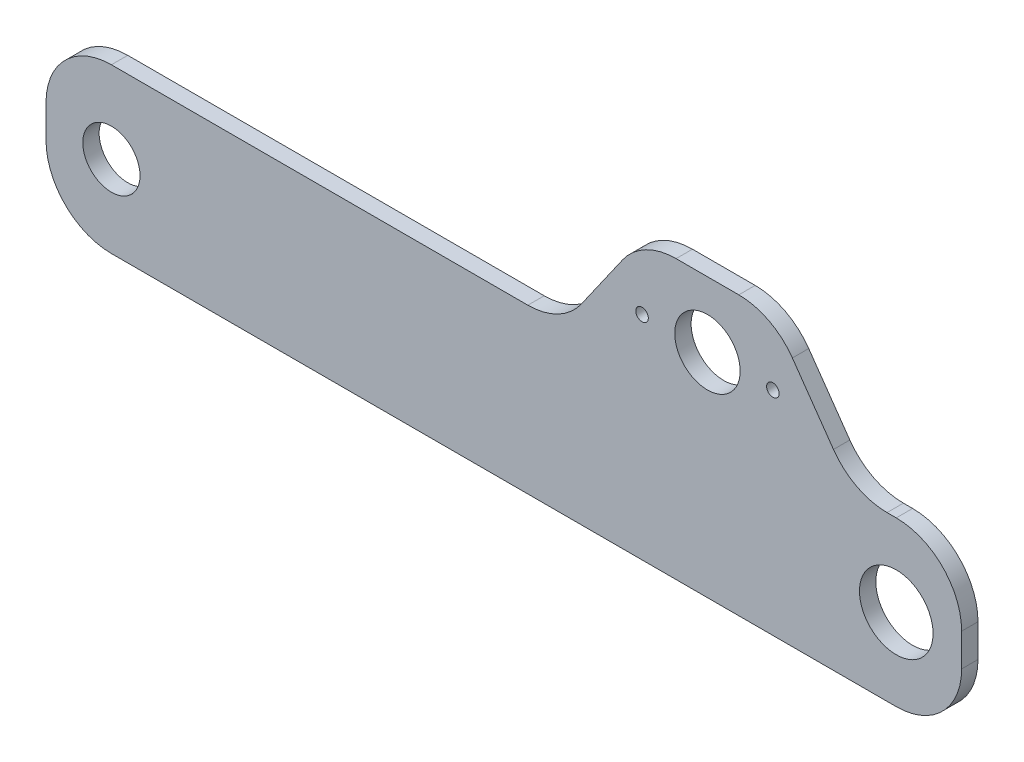
ISO-10303-21;
HEADER;
FILE_DESCRIPTION(('STEP AP214'),'2;1');
FILE_NAME('part.step','',(''),(''),'','','');
FILE_SCHEMA(('AUTOMOTIVE_DESIGN { 1 0 10303 214 1 1 1 1 }'));
ENDSEC;
DATA;
#1=APPLICATION_CONTEXT('core data for automotive mechanical design processes');
#2=APPLICATION_PROTOCOL_DEFINITION('international standard','automotive_design',2000,#1);
#3=PRODUCT_CONTEXT('',#1,'mechanical');
#4=PRODUCT('Part','Part','',(#3));
#5=PRODUCT_RELATED_PRODUCT_CATEGORY('part','',(#4));
#6=PRODUCT_DEFINITION_FORMATION('','',#4);
#7=PRODUCT_DEFINITION_CONTEXT('part definition',#1,'design');
#8=PRODUCT_DEFINITION('design','',#6,#7);
#9=PRODUCT_DEFINITION_SHAPE('','',#8);
#10=(LENGTH_UNIT() NAMED_UNIT(*) SI_UNIT(.MILLI.,.METRE.));
#11=(NAMED_UNIT(*) PLANE_ANGLE_UNIT() SI_UNIT($,.RADIAN.));
#12=(NAMED_UNIT(*) SI_UNIT($,.STERADIAN.) SOLID_ANGLE_UNIT());
#13=UNCERTAINTY_MEASURE_WITH_UNIT(LENGTH_MEASURE(1.E-05),#10,'distance_accuracy_value','');
#14=(GEOMETRIC_REPRESENTATION_CONTEXT(3) GLOBAL_UNCERTAINTY_ASSIGNED_CONTEXT((#13)) GLOBAL_UNIT_ASSIGNED_CONTEXT((#10,
#11,#12)) REPRESENTATION_CONTEXT('',''));
#15=CARTESIAN_POINT('',(0.,0.,0.));
#16=DIRECTION('',(0.,0.,1.));
#17=DIRECTION('',(1.,0.,0.));
#18=AXIS2_PLACEMENT_3D('',#15,#16,#17);
#19=CARTESIAN_POINT('',(341.76482123998,69.8499999999999,6.35));
#20=DIRECTION('',(0.,0.,1.));
#21=DIRECTION('',(1.,0.,0.));
#22=AXIS2_PLACEMENT_3D('',#19,#20,#21);
#23=PLANE('',#22);
#24=CARTESIAN_POINT('',(341.76482123998,76.2,6.35));
#25=DIRECTION('',(0.,0.,1.));
#26=DIRECTION('',(1.,0.,0.));
#27=AXIS2_PLACEMENT_3D('',#24,#25,#26);
#28=CIRCLE('',#27,14.2875);
#29=CARTESIAN_POINT('',(356.05232123998,76.2,6.35));
#30=VERTEX_POINT('',#29);
#31=EDGE_CURVE('E400',#30,#30,#28,.T.);
#32=ORIENTED_EDGE('',*,*,#31,.F.);
#33=EDGE_LOOP('',(#32));
#34=FACE_BOUND('',#33,.T.);
#35=CARTESIAN_POINT('',(36.9648212399797,76.2,6.35));
#36=DIRECTION('',(0.,0.,1.));
#37=DIRECTION('',(1.,0.,0.));
#38=AXIS2_PLACEMENT_3D('',#35,#36,#37);
#39=CIRCLE('',#38,11.1125);
#40=CARTESIAN_POINT('',(48.0773212399797,76.2,6.35));
#41=VERTEX_POINT('',#40);
#42=EDGE_CURVE('E416',#41,#41,#39,.T.);
#43=ORIENTED_EDGE('',*,*,#42,.F.);
#44=EDGE_LOOP('',(#43));
#45=FACE_BOUND('',#44,.T.);
#46=CARTESIAN_POINT('',(341.76482123998,69.8499999999999,6.35));
#47=DIRECTION('',(0.,0.,1.));
#48=DIRECTION('',(1.,0.,0.));
#49=AXIS2_PLACEMENT_3D('',#46,#47,#48);
#50=CIRCLE('',#49,25.4);
#51=CARTESIAN_POINT('',(341.764821239979,44.4499999999999,6.35));
#52=VERTEX_POINT('',#51);
#53=CARTESIAN_POINT('',(367.16482123998,69.8500000000001,6.35));
#54=VERTEX_POINT('',#53);
#55=EDGE_CURVE('E236',#52,#54,#50,.T.);
#56=ORIENTED_EDGE('',*,*,#55,.T.);
#57=DIRECTION('',(0.,1.,0.));
#58=VECTOR('',#57,1.);
#59=CARTESIAN_POINT('',(367.16482123998,69.8500000000001,6.35));
#60=LINE('',#59,#58);
#61=CARTESIAN_POINT('',(367.16482123998,82.5499999999998,6.35));
#62=VERTEX_POINT('',#61);
#63=EDGE_CURVE('E124',#54,#62,#60,.T.);
#64=ORIENTED_EDGE('',*,*,#63,.T.);
#65=CARTESIAN_POINT('',(341.76482123998,82.55,6.35));
#66=DIRECTION('',(0.,0.,1.));
#67=DIRECTION('',(-1.,0.,0.));
#68=AXIS2_PLACEMENT_3D('',#65,#66,#67);
#69=CIRCLE('',#68,25.4);
#70=CARTESIAN_POINT('',(341.764821239979,107.95,6.35));
#71=VERTEX_POINT('',#70);
#72=EDGE_CURVE('E289',#62,#71,#69,.T.);
#73=ORIENTED_EDGE('',*,*,#72,.T.);
#74=DIRECTION('',(-1.,0.,0.));
#75=VECTOR('',#74,1.);
#76=CARTESIAN_POINT('',(338.192123961331,107.95,6.35));
#77=LINE('',#76,#75);
#78=CARTESIAN_POINT('',(338.192123961331,107.95,6.35));
#79=VERTEX_POINT('',#78);
#80=EDGE_CURVE('E309',#71,#79,#77,.T.);
#81=ORIENTED_EDGE('',*,*,#80,.T.);
#82=CARTESIAN_POINT('',(338.192123961331,133.35,6.35));
#83=DIRECTION('',(0.,0.,-1.));
#84=DIRECTION('',(1.,0.,0.));
#85=AXIS2_PLACEMENT_3D('',#82,#83,#84);
#86=CIRCLE('',#85,25.4);
#87=CARTESIAN_POINT('',(317.38566203639,118.781158516684,6.35));
#88=VERTEX_POINT('',#87);
#89=EDGE_CURVE('E305',#79,#88,#86,.T.);
#90=ORIENTED_EDGE('',*,*,#89,.T.);
#91=DIRECTION('',(-0.573576436351044,0.819152044288993,0.));
#92=VECTOR('',#91,1.);
#93=CARTESIAN_POINT('',(301.429554644821,141.568841483316,6.35));
#94=LINE('',#93,#92);
#95=CARTESIAN_POINT('',(301.429554644821,141.568841483316,6.35));
#96=VERTEX_POINT('',#95);
#97=EDGE_CURVE('E308',#88,#96,#94,.T.);
#98=ORIENTED_EDGE('',*,*,#97,.T.);
#99=CARTESIAN_POINT('',(280.623092719881,127.,6.35));
#100=DIRECTION('',(0.,0.,1.));
#101=DIRECTION('',(-1.,0.,0.));
#102=AXIS2_PLACEMENT_3D('',#99,#100,#101);
#103=CIRCLE('',#102,25.4);
#104=CARTESIAN_POINT('',(280.623092719881,152.4,6.35));
#105=VERTEX_POINT('',#104);
#106=EDGE_CURVE('E313',#96,#105,#103,.T.);
#107=ORIENTED_EDGE('',*,*,#106,.T.);
#108=DIRECTION('',(-1.,0.,0.));
#109=VECTOR('',#108,1.);
#110=CARTESIAN_POINT('',(256.267898887909,152.4,6.35));
#111=LINE('',#110,#109);
#112=CARTESIAN_POINT('',(256.267898887909,152.4,6.35));
#113=VERTEX_POINT('',#112);
#114=EDGE_CURVE('E320',#105,#113,#111,.T.);
#115=ORIENTED_EDGE('',*,*,#114,.T.);
#116=CARTESIAN_POINT('',(256.267898887909,127.,6.35));
#117=DIRECTION('',(0.,0.,1.));
#118=DIRECTION('',(-1.,0.,0.));
#119=AXIS2_PLACEMENT_3D('',#116,#117,#118);
#120=CIRCLE('',#119,25.4);
#121=CARTESIAN_POINT('',(235.461436962969,141.568841483316,6.35));
#122=VERTEX_POINT('',#121);
#123=EDGE_CURVE('E323',#113,#122,#120,.T.);
#124=ORIENTED_EDGE('',*,*,#123,.T.);
#125=DIRECTION('',(-0.573576436351043,-0.819152044288994,0.));
#126=VECTOR('',#125,1.);
#127=CARTESIAN_POINT('',(219.5053295714,118.781158516684,6.35));
#128=LINE('',#127,#126);
#129=CARTESIAN_POINT('',(219.5053295714,118.781158516684,6.35));
#130=VERTEX_POINT('',#129);
#131=EDGE_CURVE('E326',#122,#130,#128,.T.);
#132=ORIENTED_EDGE('',*,*,#131,.T.);
#133=CARTESIAN_POINT('',(198.698867646459,133.35,6.35));
#134=DIRECTION('',(0.,0.,-1.));
#135=DIRECTION('',(-1.,0.,0.));
#136=AXIS2_PLACEMENT_3D('',#133,#134,#135);
#137=CIRCLE('',#136,25.4);
#138=CARTESIAN_POINT('',(198.698867646459,107.95,6.35));
#139=VERTEX_POINT('',#138);
#140=EDGE_CURVE('E329',#130,#139,#137,.T.);
#141=ORIENTED_EDGE('',*,*,#140,.T.);
#142=DIRECTION('',(-1.,0.,0.));
#143=VECTOR('',#142,1.);
#144=CARTESIAN_POINT('',(36.9648212399799,107.95,6.35));
#145=LINE('',#144,#143);
#146=CARTESIAN_POINT('',(36.9648212399799,107.95,6.35));
#147=VERTEX_POINT('',#146);
#148=EDGE_CURVE('E332',#139,#147,#145,.T.);
#149=ORIENTED_EDGE('',*,*,#148,.T.);
#150=CARTESIAN_POINT('',(36.9648212399797,82.55,6.35));
#151=DIRECTION('',(0.,0.,1.));
#152=DIRECTION('',(-1.,0.,0.));
#153=AXIS2_PLACEMENT_3D('',#150,#151,#152);
#154=CIRCLE('',#153,25.4);
#155=CARTESIAN_POINT('',(11.5648212399797,82.5499999999998,6.35));
#156=VERTEX_POINT('',#155);
#157=EDGE_CURVE('E167',#147,#156,#154,.T.);
#158=ORIENTED_EDGE('',*,*,#157,.T.);
#159=DIRECTION('',(0.,-1.,0.));
#160=VECTOR('',#159,1.);
#161=CARTESIAN_POINT('',(11.5648212399797,69.8500000000002,6.35));
#162=LINE('',#161,#160);
#163=CARTESIAN_POINT('',(11.5648212399797,69.85,6.35));
#164=VERTEX_POINT('',#163);
#165=EDGE_CURVE('E161',#156,#164,#162,.T.);
#166=ORIENTED_EDGE('',*,*,#165,.T.);
#167=CARTESIAN_POINT('',(36.9648212399797,69.85,6.35));
#168=DIRECTION('',(0.,0.,1.));
#169=DIRECTION('',(-1.,0.,0.));
#170=AXIS2_PLACEMENT_3D('',#167,#168,#169);
#171=CIRCLE('',#170,25.4);
#172=CARTESIAN_POINT('',(36.9648212399799,44.45,6.35));
#173=VERTEX_POINT('',#172);
#174=EDGE_CURVE('E165',#164,#173,#171,.T.);
#175=ORIENTED_EDGE('',*,*,#174,.T.);
#176=DIRECTION('',(1.,0.,0.));
#177=VECTOR('',#176,1.);
#178=CARTESIAN_POINT('',(36.9648212399799,44.45,6.35));
#179=LINE('',#178,#177);
#180=EDGE_CURVE('E57',#173,#52,#179,.T.);
#181=ORIENTED_EDGE('',*,*,#180,.T.);
#182=EDGE_LOOP('',(#56,#64,#73,#81,#90,#98,#107,#115,#124,#132,#141,#149,#158,#166,#175,#181));
#183=FACE_BOUND('',#182,.T.);
#184=CARTESIAN_POINT('',(243.045495803895,127.,6.35));
#185=DIRECTION('',(0.,0.,1.));
#186=DIRECTION('',(1.,0.,0.));
#187=AXIS2_PLACEMENT_3D('',#184,#185,#186);
#188=CIRCLE('',#187,2.43839999999994);
#189=CARTESIAN_POINT('',(245.483895803895,127.,6.35));
#190=VERTEX_POINT('',#189);
#191=EDGE_CURVE('E194',#190,#190,#188,.T.);
#192=ORIENTED_EDGE('',*,*,#191,.F.);
#193=EDGE_LOOP('',(#192));
#194=FACE_BOUND('',#193,.T.);
#195=CARTESIAN_POINT('',(293.845495803895,127.,6.35));
#196=DIRECTION('',(0.,0.,1.));
#197=DIRECTION('',(1.,0.,0.));
#198=AXIS2_PLACEMENT_3D('',#195,#196,#197);
#199=CIRCLE('',#198,2.4384);
#200=CARTESIAN_POINT('',(296.283895803895,127.,6.35));
#201=VERTEX_POINT('',#200);
#202=EDGE_CURVE('E408',#201,#201,#199,.T.);
#203=ORIENTED_EDGE('',*,*,#202,.F.);
#204=EDGE_LOOP('',(#203));
#205=FACE_BOUND('',#204,.T.);
#206=CARTESIAN_POINT('',(268.445495803895,127.,6.35));
#207=DIRECTION('',(0.,0.,1.));
#208=DIRECTION('',(1.,0.,0.));
#209=AXIS2_PLACEMENT_3D('',#206,#207,#208);
#210=CIRCLE('',#209,12.7);
#211=CARTESIAN_POINT('',(281.145495803895,127.,6.35));
#212=VERTEX_POINT('',#211);
#213=EDGE_CURVE('E389',#212,#212,#210,.T.);
#214=ORIENTED_EDGE('',*,*,#213,.F.);
#215=EDGE_LOOP('',(#214));
#216=FACE_BOUND('',#215,.T.);
#217=ADVANCED_FACE('F39',(#34,#45,#183,#194,#205,#216),#23,.T.);
#218=CARTESIAN_POINT('',(341.76482123998,69.8499999999999,0.));
#219=DIRECTION('',(0.,0.,1.));
#220=DIRECTION('',(1.,0.,0.));
#221=AXIS2_PLACEMENT_3D('',#218,#219,#220);
#222=PLANE('',#221);
#223=CARTESIAN_POINT('',(341.76482123998,69.8499999999999,0.));
#224=DIRECTION('',(0.,0.,1.));
#225=DIRECTION('',(1.,0.,0.));
#226=AXIS2_PLACEMENT_3D('',#223,#224,#225);
#227=CIRCLE('',#226,25.4);
#228=CARTESIAN_POINT('',(341.764821239979,44.4499999999999,0.));
#229=VERTEX_POINT('',#228);
#230=CARTESIAN_POINT('',(367.16482123998,69.8500000000001,0.));
#231=VERTEX_POINT('',#230);
#232=EDGE_CURVE('E189',#229,#231,#227,.T.);
#233=ORIENTED_EDGE('',*,*,#232,.F.);
#234=DIRECTION('',(1.,0.,0.));
#235=VECTOR('',#234,1.);
#236=CARTESIAN_POINT('',(36.9648212399799,44.45,0.));
#237=LINE('',#236,#235);
#238=CARTESIAN_POINT('',(36.9648212399799,44.45,0.));
#239=VERTEX_POINT('',#238);
#240=EDGE_CURVE('E116',#239,#229,#237,.T.);
#241=ORIENTED_EDGE('',*,*,#240,.F.);
#242=CARTESIAN_POINT('',(36.9648212399797,69.85,0.));
#243=DIRECTION('',(0.,0.,1.));
#244=DIRECTION('',(-1.,0.,0.));
#245=AXIS2_PLACEMENT_3D('',#242,#243,#244);
#246=CIRCLE('',#245,25.4);
#247=CARTESIAN_POINT('',(11.5648212399797,69.85,0.));
#248=VERTEX_POINT('',#247);
#249=EDGE_CURVE('E110',#248,#239,#246,.T.);
#250=ORIENTED_EDGE('',*,*,#249,.F.);
#251=DIRECTION('',(0.,-1.,0.));
#252=VECTOR('',#251,1.);
#253=CARTESIAN_POINT('',(11.5648212399797,69.8500000000002,0.));
#254=LINE('',#253,#252);
#255=CARTESIAN_POINT('',(11.5648212399797,82.5499999999998,0.));
#256=VERTEX_POINT('',#255);
#257=EDGE_CURVE('E176',#256,#248,#254,.T.);
#258=ORIENTED_EDGE('',*,*,#257,.F.);
#259=CARTESIAN_POINT('',(36.9648212399797,82.55,0.));
#260=DIRECTION('',(0.,0.,1.));
#261=DIRECTION('',(-1.,0.,0.));
#262=AXIS2_PLACEMENT_3D('',#259,#260,#261);
#263=CIRCLE('',#262,25.4);
#264=CARTESIAN_POINT('',(36.9648212399799,107.95,0.));
#265=VERTEX_POINT('',#264);
#266=EDGE_CURVE('E227',#265,#256,#263,.T.);
#267=ORIENTED_EDGE('',*,*,#266,.F.);
#268=DIRECTION('',(-1.,0.,0.));
#269=VECTOR('',#268,1.);
#270=CARTESIAN_POINT('',(36.9648212399799,107.95,0.));
#271=LINE('',#270,#269);
#272=CARTESIAN_POINT('',(198.698867646459,107.95,0.));
#273=VERTEX_POINT('',#272);
#274=EDGE_CURVE('E224',#273,#265,#271,.T.);
#275=ORIENTED_EDGE('',*,*,#274,.F.);
#276=CARTESIAN_POINT('',(198.698867646459,133.35,0.));
#277=DIRECTION('',(0.,0.,-1.));
#278=DIRECTION('',(-1.,0.,0.));
#279=AXIS2_PLACEMENT_3D('',#276,#277,#278);
#280=CIRCLE('',#279,25.4);
#281=CARTESIAN_POINT('',(219.5053295714,118.781158516684,0.));
#282=VERTEX_POINT('',#281);
#283=EDGE_CURVE('E221',#282,#273,#280,.T.);
#284=ORIENTED_EDGE('',*,*,#283,.F.);
#285=DIRECTION('',(-0.573576436351043,-0.819152044288994,0.));
#286=VECTOR('',#285,1.);
#287=CARTESIAN_POINT('',(219.5053295714,118.781158516684,0.));
#288=LINE('',#287,#286);
#289=CARTESIAN_POINT('',(235.461436962969,141.568841483316,0.));
#290=VERTEX_POINT('',#289);
#291=EDGE_CURVE('E218',#290,#282,#288,.T.);
#292=ORIENTED_EDGE('',*,*,#291,.F.);
#293=CARTESIAN_POINT('',(256.267898887909,127.,0.));
#294=DIRECTION('',(0.,0.,1.));
#295=DIRECTION('',(-1.,0.,0.));
#296=AXIS2_PLACEMENT_3D('',#293,#294,#295);
#297=CIRCLE('',#296,25.4);
#298=CARTESIAN_POINT('',(256.267898887909,152.4,0.));
#299=VERTEX_POINT('',#298);
#300=EDGE_CURVE('E215',#299,#290,#297,.T.);
#301=ORIENTED_EDGE('',*,*,#300,.F.);
#302=DIRECTION('',(-1.,0.,0.));
#303=VECTOR('',#302,1.);
#304=CARTESIAN_POINT('',(256.267898887909,152.4,0.));
#305=LINE('',#304,#303);
#306=CARTESIAN_POINT('',(280.623092719881,152.4,0.));
#307=VERTEX_POINT('',#306);
#308=EDGE_CURVE('E212',#307,#299,#305,.T.);
#309=ORIENTED_EDGE('',*,*,#308,.F.);
#310=CARTESIAN_POINT('',(280.623092719881,127.,0.));
#311=DIRECTION('',(0.,0.,1.));
#312=DIRECTION('',(-1.,0.,0.));
#313=AXIS2_PLACEMENT_3D('',#310,#311,#312);
#314=CIRCLE('',#313,25.4);
#315=CARTESIAN_POINT('',(301.429554644821,141.568841483316,0.));
#316=VERTEX_POINT('',#315);
#317=EDGE_CURVE('E209',#316,#307,#314,.T.);
#318=ORIENTED_EDGE('',*,*,#317,.F.);
#319=DIRECTION('',(-0.573576436351044,0.819152044288993,0.));
#320=VECTOR('',#319,1.);
#321=CARTESIAN_POINT('',(301.429554644821,141.568841483316,0.));
#322=LINE('',#321,#320);
#323=CARTESIAN_POINT('',(317.38566203639,118.781158516684,0.));
#324=VERTEX_POINT('',#323);
#325=EDGE_CURVE('E206',#324,#316,#322,.T.);
#326=ORIENTED_EDGE('',*,*,#325,.F.);
#327=CARTESIAN_POINT('',(338.192123961331,133.35,0.));
#328=DIRECTION('',(0.,0.,-1.));
#329=DIRECTION('',(1.,0.,0.));
#330=AXIS2_PLACEMENT_3D('',#327,#328,#329);
#331=CIRCLE('',#330,25.4);
#332=CARTESIAN_POINT('',(338.192123961331,107.95,0.));
#333=VERTEX_POINT('',#332);
#334=EDGE_CURVE('E203',#333,#324,#331,.T.);
#335=ORIENTED_EDGE('',*,*,#334,.F.);
#336=DIRECTION('',(-1.,0.,0.));
#337=VECTOR('',#336,1.);
#338=CARTESIAN_POINT('',(338.192123961331,107.95,0.));
#339=LINE('',#338,#337);
#340=CARTESIAN_POINT('',(341.764821239979,107.95,0.));
#341=VERTEX_POINT('',#340);
#342=EDGE_CURVE('E200',#341,#333,#339,.T.);
#343=ORIENTED_EDGE('',*,*,#342,.F.);
#344=CARTESIAN_POINT('',(341.76482123998,82.55,0.));
#345=DIRECTION('',(0.,0.,1.));
#346=DIRECTION('',(-1.,0.,0.));
#347=AXIS2_PLACEMENT_3D('',#344,#345,#346);
#348=CIRCLE('',#347,25.4);
#349=CARTESIAN_POINT('',(367.16482123998,82.5499999999998,0.));
#350=VERTEX_POINT('',#349);
#351=EDGE_CURVE('E197',#350,#341,#348,.T.);
#352=ORIENTED_EDGE('',*,*,#351,.F.);
#353=DIRECTION('',(0.,1.,0.));
#354=VECTOR('',#353,1.);
#355=CARTESIAN_POINT('',(367.16482123998,69.8500000000001,0.));
#356=LINE('',#355,#354);
#357=EDGE_CURVE('E193',#231,#350,#356,.T.);
#358=ORIENTED_EDGE('',*,*,#357,.F.);
#359=EDGE_LOOP('',(#233,#241,#250,#258,#267,#275,#284,#292,#301,#309,#318,#326,#335,#343,#352,#358));
#360=FACE_BOUND('',#359,.T.);
#361=CARTESIAN_POINT('',(243.045495803895,127.,0.));
#362=DIRECTION('',(0.,0.,1.));
#363=DIRECTION('',(1.,0.,0.));
#364=AXIS2_PLACEMENT_3D('',#361,#362,#363);
#365=CIRCLE('',#364,2.43839999999994);
#366=CARTESIAN_POINT('',(245.483895803895,127.,0.));
#367=VERTEX_POINT('',#366);
#368=EDGE_CURVE('E420',#367,#367,#365,.T.);
#369=ORIENTED_EDGE('',*,*,#368,.T.);
#370=EDGE_LOOP('',(#369));
#371=FACE_BOUND('',#370,.T.);
#372=CARTESIAN_POINT('',(36.9648212399797,76.2,0.));
#373=DIRECTION('',(0.,0.,1.));
#374=DIRECTION('',(1.,0.,0.));
#375=AXIS2_PLACEMENT_3D('',#372,#373,#374);
#376=CIRCLE('',#375,11.1125);
#377=CARTESIAN_POINT('',(48.0773212399797,76.2,0.));
#378=VERTEX_POINT('',#377);
#379=EDGE_CURVE('E412',#378,#378,#376,.T.);
#380=ORIENTED_EDGE('',*,*,#379,.T.);
#381=EDGE_LOOP('',(#380));
#382=FACE_BOUND('',#381,.T.);
#383=CARTESIAN_POINT('',(293.845495803895,127.,0.));
#384=DIRECTION('',(0.,0.,1.));
#385=DIRECTION('',(1.,0.,0.));
#386=AXIS2_PLACEMENT_3D('',#383,#384,#385);
#387=CIRCLE('',#386,2.4384);
#388=CARTESIAN_POINT('',(296.283895803895,127.,0.));
#389=VERTEX_POINT('',#388);
#390=EDGE_CURVE('E404',#389,#389,#387,.T.);
#391=ORIENTED_EDGE('',*,*,#390,.T.);
#392=EDGE_LOOP('',(#391));
#393=FACE_BOUND('',#392,.T.);
#394=CARTESIAN_POINT('',(341.76482123998,76.2,0.));
#395=DIRECTION('',(0.,0.,1.));
#396=DIRECTION('',(1.,0.,0.));
#397=AXIS2_PLACEMENT_3D('',#394,#395,#396);
#398=CIRCLE('',#397,14.2875);
#399=CARTESIAN_POINT('',(356.05232123998,76.2,0.));
#400=VERTEX_POINT('',#399);
#401=EDGE_CURVE('E397',#400,#400,#398,.T.);
#402=ORIENTED_EDGE('',*,*,#401,.T.);
#403=EDGE_LOOP('',(#402));
#404=FACE_BOUND('',#403,.T.);
#405=CARTESIAN_POINT('',(268.445495803895,127.,0.));
#406=DIRECTION('',(0.,0.,1.));
#407=DIRECTION('',(1.,0.,0.));
#408=AXIS2_PLACEMENT_3D('',#405,#406,#407);
#409=CIRCLE('',#408,12.7);
#410=CARTESIAN_POINT('',(281.145495803895,127.,0.));
#411=VERTEX_POINT('',#410);
#412=EDGE_CURVE('E392',#411,#411,#409,.T.);
#413=ORIENTED_EDGE('',*,*,#412,.T.);
#414=EDGE_LOOP('',(#413));
#415=FACE_BOUND('',#414,.T.);
#416=ADVANCED_FACE('F293',(#360,#371,#382,#393,#404,#415),#222,.F.);
#417=CARTESIAN_POINT('',(341.76482123998,69.8499999999999,6.35));
#418=DIRECTION('',(0.,0.,-1.));
#419=DIRECTION('',(-1.,0.,0.));
#420=AXIS2_PLACEMENT_3D('',#417,#418,#419);
#421=CYLINDRICAL_SURFACE('',#420,25.4);
#422=ORIENTED_EDGE('',*,*,#232,.T.);
#423=DIRECTION('',(0.,0.,-1.));
#424=VECTOR('',#423,1.);
#425=CARTESIAN_POINT('',(367.16482123998,69.8500000000001,6.35));
#426=LINE('',#425,#424);
#427=EDGE_CURVE('E11',#54,#231,#426,.T.);
#428=ORIENTED_EDGE('',*,*,#427,.F.);
#429=ORIENTED_EDGE('',*,*,#55,.F.);
#430=DIRECTION('',(0.,0.,-1.));
#431=VECTOR('',#430,1.);
#432=CARTESIAN_POINT('',(341.764821239979,44.4499999999999,6.35));
#433=LINE('',#432,#431);
#434=EDGE_CURVE('E185',#52,#229,#433,.T.);
#435=ORIENTED_EDGE('',*,*,#434,.T.);
#436=EDGE_LOOP('',(#422,#428,#429,#435));
#437=FACE_BOUND('',#436,.T.);
#438=ADVANCED_FACE('F41',(#437),#421,.T.);
#439=CARTESIAN_POINT('',(367.16482123998,69.8500000000001,6.35));
#440=DIRECTION('',(-1.,0.,0.));
#441=DIRECTION('',(0.,0.,1.));
#442=AXIS2_PLACEMENT_3D('',#439,#440,#441);
#443=PLANE('',#442);
#444=ORIENTED_EDGE('',*,*,#357,.T.);
#445=DIRECTION('',(0.,0.,-1.));
#446=VECTOR('',#445,1.);
#447=CARTESIAN_POINT('',(367.16482123998,82.5499999999998,6.35));
#448=LINE('',#447,#446);
#449=EDGE_CURVE('E49',#62,#350,#448,.T.);
#450=ORIENTED_EDGE('',*,*,#449,.F.);
#451=ORIENTED_EDGE('',*,*,#63,.F.);
#452=ORIENTED_EDGE('',*,*,#427,.T.);
#453=EDGE_LOOP('',(#444,#450,#451,#452));
#454=FACE_BOUND('',#453,.T.);
#455=ADVANCED_FACE('F585',(#454),#443,.F.);
#456=CARTESIAN_POINT('',(341.76482123998,82.55,6.35));
#457=DIRECTION('',(0.,0.,-1.));
#458=DIRECTION('',(-1.,0.,0.));
#459=AXIS2_PLACEMENT_3D('',#456,#457,#458);
#460=CYLINDRICAL_SURFACE('',#459,25.4);
#461=ORIENTED_EDGE('',*,*,#351,.T.);
#462=DIRECTION('',(0.,0.,-1.));
#463=VECTOR('',#462,1.);
#464=CARTESIAN_POINT('',(341.764821239979,107.95,6.35));
#465=LINE('',#464,#463);
#466=EDGE_CURVE('E279',#71,#341,#465,.T.);
#467=ORIENTED_EDGE('',*,*,#466,.F.);
#468=ORIENTED_EDGE('',*,*,#72,.F.);
#469=ORIENTED_EDGE('',*,*,#449,.T.);
#470=EDGE_LOOP('',(#461,#467,#468,#469));
#471=FACE_BOUND('',#470,.T.);
#472=ADVANCED_FACE('F287',(#471),#460,.T.);
#473=CARTESIAN_POINT('',(338.192123961331,107.95,6.35));
#474=DIRECTION('',(0.,-1.,0.));
#475=DIRECTION('',(0.,0.,-1.));
#476=AXIS2_PLACEMENT_3D('',#473,#474,#475);
#477=PLANE('',#476);
#478=ORIENTED_EDGE('',*,*,#342,.T.);
#479=DIRECTION('',(0.,0.,-1.));
#480=VECTOR('',#479,1.);
#481=CARTESIAN_POINT('',(338.192123961331,107.95,6.35));
#482=LINE('',#481,#480);
#483=EDGE_CURVE('E275',#79,#333,#482,.T.);
#484=ORIENTED_EDGE('',*,*,#483,.F.);
#485=ORIENTED_EDGE('',*,*,#80,.F.);
#486=ORIENTED_EDGE('',*,*,#466,.T.);
#487=EDGE_LOOP('',(#478,#484,#485,#486));
#488=FACE_BOUND('',#487,.T.);
#489=ADVANCED_FACE('F299',(#488),#477,.F.);
#490=CARTESIAN_POINT('',(338.192123961331,133.35,6.35));
#491=DIRECTION('',(0.,0.,-1.));
#492=DIRECTION('',(-1.,0.,0.));
#493=AXIS2_PLACEMENT_3D('',#490,#491,#492);
#494=CYLINDRICAL_SURFACE('',#493,25.4);
#495=ORIENTED_EDGE('',*,*,#334,.T.);
#496=DIRECTION('',(0.,0.,-1.));
#497=VECTOR('',#496,1.);
#498=CARTESIAN_POINT('',(317.38566203639,118.781158516684,6.35));
#499=LINE('',#498,#497);
#500=EDGE_CURVE('E271',#88,#324,#499,.T.);
#501=ORIENTED_EDGE('',*,*,#500,.F.);
#502=ORIENTED_EDGE('',*,*,#89,.F.);
#503=ORIENTED_EDGE('',*,*,#483,.T.);
#504=EDGE_LOOP('',(#495,#501,#502,#503));
#505=FACE_BOUND('',#504,.T.);
#506=ADVANCED_FACE('F303',(#505),#494,.F.);
#507=CARTESIAN_POINT('',(301.429554644821,141.568841483316,6.35));
#508=DIRECTION('',(-0.819152044288993,-0.573576436351044,0.));
#509=DIRECTION('',(0.573576436351044,-0.819152044288993,0.));
#510=AXIS2_PLACEMENT_3D('',#507,#508,#509);
#511=PLANE('',#510);
#512=ORIENTED_EDGE('',*,*,#325,.T.);
#513=DIRECTION('',(0.,0.,-1.));
#514=VECTOR('',#513,1.);
#515=CARTESIAN_POINT('',(301.429554644821,141.568841483316,6.35));
#516=LINE('',#515,#514);
#517=EDGE_CURVE('E267',#96,#316,#516,.T.);
#518=ORIENTED_EDGE('',*,*,#517,.F.);
#519=ORIENTED_EDGE('',*,*,#97,.F.);
#520=ORIENTED_EDGE('',*,*,#500,.T.);
#521=EDGE_LOOP('',(#512,#518,#519,#520));
#522=FACE_BOUND('',#521,.T.);
#523=ADVANCED_FACE('F550',(#522),#511,.F.);
#524=CARTESIAN_POINT('',(280.623092719881,127.,6.35));
#525=DIRECTION('',(0.,0.,-1.));
#526=DIRECTION('',(-1.,0.,0.));
#527=AXIS2_PLACEMENT_3D('',#524,#525,#526);
#528=CYLINDRICAL_SURFACE('',#527,25.4);
#529=ORIENTED_EDGE('',*,*,#317,.T.);
#530=DIRECTION('',(0.,0.,-1.));
#531=VECTOR('',#530,1.);
#532=CARTESIAN_POINT('',(280.623092719881,152.4,6.35));
#533=LINE('',#532,#531);
#534=EDGE_CURVE('E263',#105,#307,#533,.T.);
#535=ORIENTED_EDGE('',*,*,#534,.F.);
#536=ORIENTED_EDGE('',*,*,#106,.F.);
#537=ORIENTED_EDGE('',*,*,#517,.T.);
#538=EDGE_LOOP('',(#529,#535,#536,#537));
#539=FACE_BOUND('',#538,.T.);
#540=ADVANCED_FACE('F540',(#539),#528,.T.);
#541=CARTESIAN_POINT('',(256.267898887909,152.4,6.35));
#542=DIRECTION('',(0.,-1.,0.));
#543=DIRECTION('',(0.,0.,-1.));
#544=AXIS2_PLACEMENT_3D('',#541,#542,#543);
#545=PLANE('',#544);
#546=ORIENTED_EDGE('',*,*,#308,.T.);
#547=DIRECTION('',(0.,0.,-1.));
#548=VECTOR('',#547,1.);
#549=CARTESIAN_POINT('',(256.267898887909,152.4,6.35));
#550=LINE('',#549,#548);
#551=EDGE_CURVE('E259',#113,#299,#550,.T.);
#552=ORIENTED_EDGE('',*,*,#551,.F.);
#553=ORIENTED_EDGE('',*,*,#114,.F.);
#554=ORIENTED_EDGE('',*,*,#534,.T.);
#555=EDGE_LOOP('',(#546,#552,#553,#554));
#556=FACE_BOUND('',#555,.T.);
#557=ADVANCED_FACE('F530',(#556),#545,.F.);
#558=CARTESIAN_POINT('',(256.267898887909,127.,6.35));
#559=DIRECTION('',(0.,0.,-1.));
#560=DIRECTION('',(-1.,0.,0.));
#561=AXIS2_PLACEMENT_3D('',#558,#559,#560);
#562=CYLINDRICAL_SURFACE('',#561,25.4);
#563=ORIENTED_EDGE('',*,*,#300,.T.);
#564=DIRECTION('',(0.,0.,-1.));
#565=VECTOR('',#564,1.);
#566=CARTESIAN_POINT('',(235.461436962969,141.568841483316,6.35));
#567=LINE('',#566,#565);
#568=EDGE_CURVE('E255',#122,#290,#567,.T.);
#569=ORIENTED_EDGE('',*,*,#568,.F.);
#570=ORIENTED_EDGE('',*,*,#123,.F.);
#571=ORIENTED_EDGE('',*,*,#551,.T.);
#572=EDGE_LOOP('',(#563,#569,#570,#571));
#573=FACE_BOUND('',#572,.T.);
#574=ADVANCED_FACE('F520',(#573),#562,.T.);
#575=CARTESIAN_POINT('',(219.5053295714,118.781158516684,6.35));
#576=DIRECTION('',(0.819152044288994,-0.573576436351043,0.));
#577=DIRECTION('',(0.573576436351043,0.819152044288994,0.));
#578=AXIS2_PLACEMENT_3D('',#575,#576,#577);
#579=PLANE('',#578);
#580=ORIENTED_EDGE('',*,*,#291,.T.);
#581=DIRECTION('',(0.,0.,-1.));
#582=VECTOR('',#581,1.);
#583=CARTESIAN_POINT('',(219.5053295714,118.781158516684,6.35));
#584=LINE('',#583,#582);
#585=EDGE_CURVE('E251',#130,#282,#584,.T.);
#586=ORIENTED_EDGE('',*,*,#585,.F.);
#587=ORIENTED_EDGE('',*,*,#131,.F.);
#588=ORIENTED_EDGE('',*,*,#568,.T.);
#589=EDGE_LOOP('',(#580,#586,#587,#588));
#590=FACE_BOUND('',#589,.T.);
#591=ADVANCED_FACE('F510',(#590),#579,.F.);
#592=CARTESIAN_POINT('',(198.698867646459,133.35,6.35));
#593=DIRECTION('',(0.,0.,-1.));
#594=DIRECTION('',(-1.,0.,0.));
#595=AXIS2_PLACEMENT_3D('',#592,#593,#594);
#596=CYLINDRICAL_SURFACE('',#595,25.4);
#597=ORIENTED_EDGE('',*,*,#283,.T.);
#598=DIRECTION('',(0.,0.,-1.));
#599=VECTOR('',#598,1.);
#600=CARTESIAN_POINT('',(198.698867646459,107.95,6.35));
#601=LINE('',#600,#599);
#602=EDGE_CURVE('E247',#139,#273,#601,.T.);
#603=ORIENTED_EDGE('',*,*,#602,.F.);
#604=ORIENTED_EDGE('',*,*,#140,.F.);
#605=ORIENTED_EDGE('',*,*,#585,.T.);
#606=EDGE_LOOP('',(#597,#603,#604,#605));
#607=FACE_BOUND('',#606,.T.);
#608=ADVANCED_FACE('F501',(#607),#596,.F.);
#609=CARTESIAN_POINT('',(36.9648212399799,107.95,6.35));
#610=DIRECTION('',(0.,-1.,0.));
#611=DIRECTION('',(1.,0.,0.));
#612=AXIS2_PLACEMENT_3D('',#609,#610,#611);
#613=PLANE('',#612);
#614=ORIENTED_EDGE('',*,*,#274,.T.);
#615=DIRECTION('',(0.,0.,-1.));
#616=VECTOR('',#615,1.);
#617=CARTESIAN_POINT('',(36.9648212399799,107.95,6.35));
#618=LINE('',#617,#616);
#619=EDGE_CURVE('E243',#147,#265,#618,.T.);
#620=ORIENTED_EDGE('',*,*,#619,.F.);
#621=ORIENTED_EDGE('',*,*,#148,.F.);
#622=ORIENTED_EDGE('',*,*,#602,.T.);
#623=EDGE_LOOP('',(#614,#620,#621,#622));
#624=FACE_BOUND('',#623,.T.);
#625=ADVANCED_FACE('F340',(#624),#613,.F.);
#626=CARTESIAN_POINT('',(36.9648212399797,82.55,6.35));
#627=DIRECTION('',(0.,0.,-1.));
#628=DIRECTION('',(-1.,0.,0.));
#629=AXIS2_PLACEMENT_3D('',#626,#627,#628);
#630=CYLINDRICAL_SURFACE('',#629,25.4);
#631=ORIENTED_EDGE('',*,*,#266,.T.);
#632=DIRECTION('',(0.,0.,-1.));
#633=VECTOR('',#632,1.);
#634=CARTESIAN_POINT('',(11.5648212399797,82.5499999999998,6.35));
#635=LINE('',#634,#633);
#636=EDGE_CURVE('E178',#156,#256,#635,.T.);
#637=ORIENTED_EDGE('',*,*,#636,.F.);
#638=ORIENTED_EDGE('',*,*,#157,.F.);
#639=ORIENTED_EDGE('',*,*,#619,.T.);
#640=EDGE_LOOP('',(#631,#637,#638,#639));
#641=FACE_BOUND('',#640,.T.);
#642=ADVANCED_FACE('F344',(#641),#630,.T.);
#643=CARTESIAN_POINT('',(11.5648212399797,69.8500000000002,6.35));
#644=DIRECTION('',(1.,0.,0.));
#645=DIRECTION('',(0.,0.,-1.));
#646=AXIS2_PLACEMENT_3D('',#643,#644,#645);
#647=PLANE('',#646);
#648=ORIENTED_EDGE('',*,*,#257,.T.);
#649=DIRECTION('',(0.,0.,-1.));
#650=VECTOR('',#649,1.);
#651=CARTESIAN_POINT('',(11.5648212399797,69.85,6.35));
#652=LINE('',#651,#650);
#653=EDGE_CURVE('E173',#164,#248,#652,.T.);
#654=ORIENTED_EDGE('',*,*,#653,.F.);
#655=ORIENTED_EDGE('',*,*,#165,.F.);
#656=ORIENTED_EDGE('',*,*,#636,.T.);
#657=EDGE_LOOP('',(#648,#654,#655,#656));
#658=FACE_BOUND('',#657,.T.);
#659=ADVANCED_FACE('F174',(#658),#647,.F.);
#660=CARTESIAN_POINT('',(36.9648212399797,69.85,6.35));
#661=DIRECTION('',(0.,0.,-1.));
#662=DIRECTION('',(-1.,0.,0.));
#663=AXIS2_PLACEMENT_3D('',#660,#661,#662);
#664=CYLINDRICAL_SURFACE('',#663,25.4);
#665=ORIENTED_EDGE('',*,*,#249,.T.);
#666=DIRECTION('',(0.,0.,-1.));
#667=VECTOR('',#666,1.);
#668=CARTESIAN_POINT('',(36.9648212399799,44.45,6.35));
#669=LINE('',#668,#667);
#670=EDGE_CURVE('E179',#173,#239,#669,.T.);
#671=ORIENTED_EDGE('',*,*,#670,.F.);
#672=ORIENTED_EDGE('',*,*,#174,.F.);
#673=ORIENTED_EDGE('',*,*,#653,.T.);
#674=EDGE_LOOP('',(#665,#671,#672,#673));
#675=FACE_BOUND('',#674,.T.);
#676=ADVANCED_FACE('F181',(#675),#664,.T.);
#677=CARTESIAN_POINT('',(36.9648212399799,44.45,6.35));
#678=DIRECTION('',(0.,1.,0.));
#679=DIRECTION('',(-1.,0.,0.));
#680=AXIS2_PLACEMENT_3D('',#677,#678,#679);
#681=PLANE('',#680);
#682=ORIENTED_EDGE('',*,*,#240,.T.);
#683=ORIENTED_EDGE('',*,*,#434,.F.);
#684=ORIENTED_EDGE('',*,*,#180,.F.);
#685=ORIENTED_EDGE('',*,*,#670,.T.);
#686=EDGE_LOOP('',(#682,#683,#684,#685));
#687=FACE_BOUND('',#686,.T.);
#688=ADVANCED_FACE('F348',(#687),#681,.F.);
#689=CARTESIAN_POINT('',(243.045495803895,127.,6.35));
#690=DIRECTION('',(0.,0.,-1.));
#691=DIRECTION('',(-1.,0.,0.));
#692=AXIS2_PLACEMENT_3D('',#689,#690,#691);
#693=CYLINDRICAL_SURFACE('',#692,2.43839999999994);
#694=ORIENTED_EDGE('',*,*,#191,.T.);
#695=EDGE_LOOP('',(#694));
#696=FACE_BOUND('',#695,.T.);
#697=ORIENTED_EDGE('',*,*,#368,.F.);
#698=EDGE_LOOP('',(#697));
#699=FACE_BOUND('',#698,.T.);
#700=ADVANCED_FACE('F350',(#696,#699),#693,.F.);
#701=CARTESIAN_POINT('',(36.9648212399797,76.2,6.35));
#702=DIRECTION('',(0.,0.,-1.));
#703=DIRECTION('',(-1.,0.,0.));
#704=AXIS2_PLACEMENT_3D('',#701,#702,#703);
#705=CYLINDRICAL_SURFACE('',#704,11.1125);
#706=ORIENTED_EDGE('',*,*,#42,.T.);
#707=EDGE_LOOP('',(#706));
#708=FACE_BOUND('',#707,.T.);
#709=ORIENTED_EDGE('',*,*,#379,.F.);
#710=EDGE_LOOP('',(#709));
#711=FACE_BOUND('',#710,.T.);
#712=ADVANCED_FACE('F356',(#708,#711),#705,.F.);
#713=CARTESIAN_POINT('',(293.845495803895,127.,6.35));
#714=DIRECTION('',(0.,0.,-1.));
#715=DIRECTION('',(-1.,0.,0.));
#716=AXIS2_PLACEMENT_3D('',#713,#714,#715);
#717=CYLINDRICAL_SURFACE('',#716,2.4384);
#718=ORIENTED_EDGE('',*,*,#202,.T.);
#719=EDGE_LOOP('',(#718));
#720=FACE_BOUND('',#719,.T.);
#721=ORIENTED_EDGE('',*,*,#390,.F.);
#722=EDGE_LOOP('',(#721));
#723=FACE_BOUND('',#722,.T.);
#724=ADVANCED_FACE('F372',(#720,#723),#717,.F.);
#725=CARTESIAN_POINT('',(341.76482123998,76.2,6.35));
#726=DIRECTION('',(0.,0.,-1.));
#727=DIRECTION('',(-1.,0.,0.));
#728=AXIS2_PLACEMENT_3D('',#725,#726,#727);
#729=CYLINDRICAL_SURFACE('',#728,14.2875);
#730=ORIENTED_EDGE('',*,*,#31,.T.);
#731=EDGE_LOOP('',(#730));
#732=FACE_BOUND('',#731,.T.);
#733=ORIENTED_EDGE('',*,*,#401,.F.);
#734=EDGE_LOOP('',(#733));
#735=FACE_BOUND('',#734,.T.);
#736=ADVANCED_FACE('F376',(#732,#735),#729,.F.);
#737=CARTESIAN_POINT('',(268.445495803895,127.,6.35));
#738=DIRECTION('',(0.,0.,-1.));
#739=DIRECTION('',(-1.,0.,0.));
#740=AXIS2_PLACEMENT_3D('',#737,#738,#739);
#741=CYLINDRICAL_SURFACE('',#740,12.7);
#742=ORIENTED_EDGE('',*,*,#213,.T.);
#743=EDGE_LOOP('',(#742));
#744=FACE_BOUND('',#743,.T.);
#745=ORIENTED_EDGE('',*,*,#412,.F.);
#746=EDGE_LOOP('',(#745));
#747=FACE_BOUND('',#746,.T.);
#748=ADVANCED_FACE('F380',(#744,#747),#741,.F.);
#749=CLOSED_SHELL('',(#217,#416,#438,#455,#472,#489,#506,#523,#540,#557,#574,#591,#608,#625,
#642,#659,#676,#688,#700,#712,#724,#736,#748));
#750=MANIFOLD_SOLID_BREP('B2',#749);
#751=ADVANCED_BREP_SHAPE_REPRESENTATION('',(#18,#750),#14);
#752=SHAPE_DEFINITION_REPRESENTATION(#9,#751);
ENDSEC;
END-ISO-10303-21;
